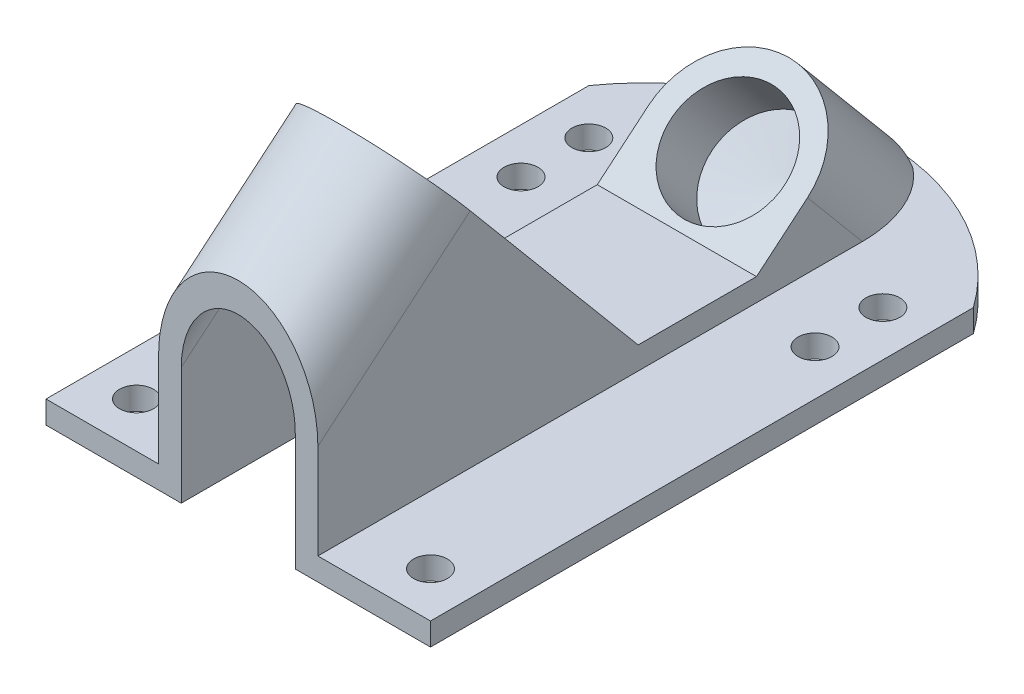
ISO-10303-21;
HEADER;
FILE_DESCRIPTION(('STEP AP214'),'2;1');
FILE_NAME('part.step','',(''),(''),'','','');
FILE_SCHEMA(('AUTOMOTIVE_DESIGN { 1 0 10303 214 1 1 1 1 }'));
ENDSEC;
DATA;
#1=APPLICATION_CONTEXT('core data for automotive mechanical design processes');
#2=APPLICATION_PROTOCOL_DEFINITION('international standard','automotive_design',2000,#1);
#3=PRODUCT_CONTEXT('',#1,'mechanical');
#4=PRODUCT('Part','Part','',(#3));
#5=PRODUCT_RELATED_PRODUCT_CATEGORY('part','',(#4));
#6=PRODUCT_DEFINITION_FORMATION('','',#4);
#7=PRODUCT_DEFINITION_CONTEXT('part definition',#1,'design');
#8=PRODUCT_DEFINITION('design','',#6,#7);
#9=PRODUCT_DEFINITION_SHAPE('','',#8);
#10=(LENGTH_UNIT() NAMED_UNIT(*) SI_UNIT(.MILLI.,.METRE.));
#11=(NAMED_UNIT(*) PLANE_ANGLE_UNIT() SI_UNIT($,.RADIAN.));
#12=(NAMED_UNIT(*) SI_UNIT($,.STERADIAN.) SOLID_ANGLE_UNIT());
#13=UNCERTAINTY_MEASURE_WITH_UNIT(LENGTH_MEASURE(1.E-05),#10,'distance_accuracy_value','');
#14=(GEOMETRIC_REPRESENTATION_CONTEXT(3) GLOBAL_UNCERTAINTY_ASSIGNED_CONTEXT((#13)) GLOBAL_UNIT_ASSIGNED_CONTEXT((#10,
#11,#12)) REPRESENTATION_CONTEXT('',''));
#15=CARTESIAN_POINT('',(0.,0.,0.));
#16=DIRECTION('',(0.,0.,1.));
#17=DIRECTION('',(1.,0.,0.));
#18=AXIS2_PLACEMENT_3D('',#15,#16,#17);
#19=CARTESIAN_POINT('',(0.,-25.0141169265101,-20.98933628726));
#20=DIRECTION('',(0.,0.766044443118977,0.64278760968654));
#21=DIRECTION('',(0.,-0.64278760968654,0.766044443118977));
#22=AXIS2_PLACEMENT_3D('',#19,#20,#21);
#23=PLANE('',#22);
#24=CARTESIAN_POINT('',(5.80920370903883,0.,-50.8));
#25=CARTESIAN_POINT('',(5.5597374760247,0.0975508140923163,-50.916256533155));
#26=CARTESIAN_POINT('',(5.30385348653295,0.188074625236957,-51.024138610302));
#27=CARTESIAN_POINT('',(4.7813617057208,0.355032638458759,-51.2231114223714));
#28=CARTESIAN_POINT('',(4.51476013955797,0.431474879596498,-51.3142117378733));
#29=CARTESIAN_POINT('',(3.70217235590198,0.639635215240299,-51.5622875657124));
#30=CARTESIAN_POINT('',(3.14287011696679,0.750391983854874,-51.694282342613));
#31=CARTESIAN_POINT('',(2.00519009620841,0.915859507768061,-51.8914788586942));
#32=CARTESIAN_POINT('',(1.42681744004951,0.970585198136284,-51.9566983967977));
#33=CARTESIAN_POINT('',(0.263865864662572,1.02440360541682,-52.020836677022));
#34=CARTESIAN_POINT('',(-0.320712427646291,1.02350188955882,-52.0197620539087));
#35=CARTESIAN_POINT('',(-1.48323459483363,0.966066932130411,-51.9513137370529));
#36=CARTESIAN_POINT('',(-2.0611781130222,0.909530713649846,-51.8839364955669));
#37=CARTESIAN_POINT('',(-3.18145877559244,0.742835579797626,-51.6852769709305));
#38=CARTESIAN_POINT('',(-3.72433952345924,0.634217809380674,-51.5558313528166));
#39=CARTESIAN_POINT('',(-4.52028655505767,0.429922538140716,-51.3123617293664));
#40=CARTESIAN_POINT('',(-4.78571929574432,0.353711161131642,-51.2215365470193));
#41=CARTESIAN_POINT('',(-5.30596477437662,0.187328202434981,-51.0232490582461));
#42=CARTESIAN_POINT('',(-5.56077088309034,0.097148067166662,-50.9157765580594));
#43=CARTESIAN_POINT('',(-5.80920370903882,0.,-50.8));
#44=B_SPLINE_CURVE_WITH_KNOTS('',3,(#24,#25,#26,#27,#28,#29,#30,#31,#32,#33,#34,#35,#36,#37,#38,
#39,#40,#41,#42,#43),.UNSPECIFIED.,.F.,.F.,(4,2,2,2,2,2,2,2,2,4),(0.,0.875380080114651,
1.75025885309408,3.49817536887797,5.24562585657085,6.9929014584814,8.74027055930166,
10.4388553372866,11.3100964019254,12.1818730837809),.UNSPECIFIED.);
#45=CARTESIAN_POINT('',(5.80920370903883,0.,-50.8));
#46=VERTEX_POINT('',#45);
#47=CARTESIAN_POINT('',(-5.80920370903881,0.,-50.8));
#48=VERTEX_POINT('',#47);
#49=EDGE_CURVE('E179',#46,#48,#44,.T.);
#50=ORIENTED_EDGE('',*,*,#49,.T.);
#51=CARTESIAN_POINT('',(0.,-6.13706088898307,-43.486135637585));
#52=DIRECTION('',(0.,0.766044443118977,0.64278760968654));
#53=DIRECTION('',(0.,-0.64278760968654,0.766044443118977));
#54=AXIS2_PLACEMENT_3D('',#51,#52,#53);
#55=CIRCLE('',#54,11.176);
#56=EDGE_CURVE('E176',#46,#48,#55,.T.);
#57=ORIENTED_EDGE('',*,*,#56,.F.);
#58=EDGE_LOOP('',(#50,#57));
#59=FACE_BOUND('',#58,.T.);
#60=ADVANCED_FACE('F52',(#59),#23,.F.);
#61=CARTESIAN_POINT('',(0.,2.3932711414289,-36.3283371770466));
#62=DIRECTION('',(0.,0.766044443118978,0.64278760968654));
#63=DIRECTION('',(0.,-0.64278760968654,0.766044443118978));
#64=AXIS2_PLACEMENT_3D('',#61,#62,#63);
#65=CONICAL_SURFACE('',#64,8.00100000000001,1.19729586686811);
#66=CARTESIAN_POINT('',(0.,-0.00870534403125435,-38.3438347600927));
#67=VERTEX_POINT('',#66);
#68=VERTEX_LOOP('',#67);
#69=FACE_BOUND('',#68,.T.);
#70=CARTESIAN_POINT('',(0.,2.39327114142889,-36.3283371770466));
#71=DIRECTION('',(0.,0.766044443118978,0.64278760968654));
#72=DIRECTION('',(0.,-0.64278760968654,0.766044443118978));
#73=AXIS2_PLACEMENT_3D('',#70,#71,#72);
#74=CIRCLE('',#73,8.001);
#75=CARTESIAN_POINT('',(0.,-2.74967252367311,-30.1992155876517));
#76=VERTEX_POINT('',#75);
#77=EDGE_CURVE('E456',#76,#76,#74,.F.);
#78=ORIENTED_EDGE('',*,*,#77,.F.);
#79=EDGE_LOOP('',(#78));
#80=FACE_BOUND('',#79,.T.);
#81=ADVANCED_FACE('F222',(#69,#80),#65,.F.);
#82=CARTESIAN_POINT('',(0.,-10.7308344214764,-47.3407693144122));
#83=DIRECTION('',(0.,0.766044443118977,0.64278760968654));
#84=DIRECTION('',(0.,-0.64278760968654,0.766044443118977));
#85=AXIS2_PLACEMENT_3D('',#82,#83,#84);
#86=CYLINDRICAL_SURFACE('',#85,8.001);
#87=CARTESIAN_POINT('',(0.,9.18382797339647,-30.6303834438542));
#88=DIRECTION('',(0.,0.766044443118977,0.64278760968654));
#89=DIRECTION('',(0.,-0.64278760968654,0.766044443118977));
#90=AXIS2_PLACEMENT_3D('',#87,#88,#89);
#91=CIRCLE('',#90,8.001);
#92=CARTESIAN_POINT('',(0.,4.04088430829446,-24.5012618544593));
#93=VERTEX_POINT('',#92);
#94=EDGE_CURVE('E202',#93,#93,#91,.T.);
#95=ORIENTED_EDGE('',*,*,#94,.T.);
#96=EDGE_LOOP('',(#95));
#97=FACE_BOUND('',#96,.T.);
#98=ORIENTED_EDGE('',*,*,#77,.T.);
#99=EDGE_LOOP('',(#98));
#100=FACE_BOUND('',#99,.T.);
#101=ADVANCED_FACE('F218',(#97,#100),#86,.F.);
#102=CARTESIAN_POINT('',(0.,-3.175,0.));
#103=DIRECTION('',(0.,1.,0.));
#104=DIRECTION('',(0.,0.,1.));
#105=AXIS2_PLACEMENT_3D('',#102,#103,#104);
#106=PLANE('',#105);
#107=CARTESIAN_POINT('',(0.,-3.175,-18.96410401224));
#108=DIRECTION('',(0.,1.,0.));
#109=DIRECTION('',(0.,0.,1.));
#110=AXIS2_PLACEMENT_3D('',#107,#108,#109);
#111=CIRCLE('',#110,33.0833443216427);
#112=CARTESIAN_POINT('',(-26.9875,-3.175,-38.1));
#113=VERTEX_POINT('',#112);
#114=CARTESIAN_POINT('',(26.9875,-3.175,-38.1));
#115=VERTEX_POINT('',#114);
#116=EDGE_CURVE('E404',#113,#115,#111,.F.);
#117=ORIENTED_EDGE('',*,*,#116,.T.);
#118=DIRECTION('',(0.,0.,-1.));
#119=VECTOR('',#118,1.);
#120=CARTESIAN_POINT('',(26.9875,-3.175,0.));
#121=LINE('',#120,#119);
#122=CARTESIAN_POINT('',(26.9875,-3.175,38.1));
#123=VERTEX_POINT('',#122);
#124=EDGE_CURVE('E370',#123,#115,#121,.T.);
#125=ORIENTED_EDGE('',*,*,#124,.F.);
#126=DIRECTION('',(-1.,0.,0.));
#127=VECTOR('',#126,1.);
#128=CARTESIAN_POINT('',(0.,-3.175,38.1));
#129=LINE('',#128,#127);
#130=CARTESIAN_POINT('',(8.00100000000003,-3.175,38.1));
#131=VERTEX_POINT('',#130);
#132=EDGE_CURVE('E368',#123,#131,#129,.T.);
#133=ORIENTED_EDGE('',*,*,#132,.T.);
#134=DIRECTION('',(0.,0.,1.));
#135=VECTOR('',#134,1.);
#136=CARTESIAN_POINT('',(8.00100000000002,-3.175,0.));
#137=LINE('',#136,#135);
#138=CARTESIAN_POINT('',(8.00100000000002,-3.175,-3.68585867101214));
#139=VERTEX_POINT('',#138);
#140=EDGE_CURVE('E329',#139,#131,#137,.T.);
#141=ORIENTED_EDGE('',*,*,#140,.F.);
#142=DIRECTION('',(1.,0.,0.));
#143=VECTOR('',#142,1.);
#144=CARTESIAN_POINT('',(0.,-3.175,-3.68585867101214));
#145=LINE('',#144,#143);
#146=CARTESIAN_POINT('',(-8.00099999999999,-3.175,-3.68585867101214));
#147=VERTEX_POINT('',#146);
#148=EDGE_CURVE('E328',#147,#139,#145,.T.);
#149=ORIENTED_EDGE('',*,*,#148,.F.);
#150=DIRECTION('',(0.,0.,1.));
#151=VECTOR('',#150,1.);
#152=CARTESIAN_POINT('',(-8.00099999999999,-3.175,0.));
#153=LINE('',#152,#151);
#154=CARTESIAN_POINT('',(-8.00099999999998,-3.175,38.1));
#155=VERTEX_POINT('',#154);
#156=EDGE_CURVE('E333',#147,#155,#153,.T.);
#157=ORIENTED_EDGE('',*,*,#156,.T.);
#158=CARTESIAN_POINT('',(-26.9875,-3.175,38.1));
#159=VERTEX_POINT('',#158);
#160=EDGE_CURVE('E366',#155,#159,#129,.T.);
#161=ORIENTED_EDGE('',*,*,#160,.T.);
#162=DIRECTION('',(0.,0.,-1.));
#163=VECTOR('',#162,1.);
#164=CARTESIAN_POINT('',(-26.9875,-3.175,0.));
#165=LINE('',#164,#163);
#166=EDGE_CURVE('E364',#159,#113,#165,.T.);
#167=ORIENTED_EDGE('',*,*,#166,.T.);
#168=EDGE_LOOP('',(#117,#125,#133,#141,#149,#157,#161,#167));
#169=FACE_BOUND('',#168,.T.);
#170=CARTESIAN_POINT('',(-20.6375,-3.175,31.75));
#171=DIRECTION('',(0.,1.,0.));
#172=DIRECTION('',(0.,0.,1.));
#173=AXIS2_PLACEMENT_3D('',#170,#171,#172);
#174=CIRCLE('',#173,2.38125);
#175=CARTESIAN_POINT('',(-20.6375,-3.175,34.13125));
#176=VERTEX_POINT('',#175);
#177=EDGE_CURVE('E374',#176,#176,#174,.T.);
#178=ORIENTED_EDGE('',*,*,#177,.T.);
#179=EDGE_LOOP('',(#178));
#180=FACE_BOUND('',#179,.T.);
#181=CARTESIAN_POINT('',(20.6375,-3.175,31.75));
#182=DIRECTION('',(0.,1.,0.));
#183=DIRECTION('',(0.,0.,1.));
#184=AXIS2_PLACEMENT_3D('',#181,#182,#183);
#185=CIRCLE('',#184,2.38125);
#186=CARTESIAN_POINT('',(20.6375,-3.175,34.13125));
#187=VERTEX_POINT('',#186);
#188=EDGE_CURVE('E371',#187,#187,#185,.F.);
#189=ORIENTED_EDGE('',*,*,#188,.F.);
#190=EDGE_LOOP('',(#189));
#191=FACE_BOUND('',#190,.T.);
#192=CARTESIAN_POINT('',(20.6375,-3.175,-22.225));
#193=DIRECTION('',(0.,1.,0.));
#194=DIRECTION('',(0.,0.,1.));
#195=AXIS2_PLACEMENT_3D('',#192,#193,#194);
#196=CIRCLE('',#195,2.38125);
#197=CARTESIAN_POINT('',(20.6375,-3.175,-19.84375));
#198=VERTEX_POINT('',#197);
#199=EDGE_CURVE('E422',#198,#198,#196,.F.);
#200=ORIENTED_EDGE('',*,*,#199,.F.);
#201=EDGE_LOOP('',(#200));
#202=FACE_BOUND('',#201,.T.);
#203=CARTESIAN_POINT('',(20.6375,-3.175,-31.75));
#204=DIRECTION('',(0.,1.,0.));
#205=DIRECTION('',(0.,0.,1.));
#206=AXIS2_PLACEMENT_3D('',#203,#204,#205);
#207=CIRCLE('',#206,2.38125);
#208=CARTESIAN_POINT('',(20.6375,-3.175,-29.36875));
#209=VERTEX_POINT('',#208);
#210=EDGE_CURVE('E436',#209,#209,#207,.F.);
#211=ORIENTED_EDGE('',*,*,#210,.F.);
#212=EDGE_LOOP('',(#211));
#213=FACE_BOUND('',#212,.T.);
#214=CARTESIAN_POINT('',(-20.6375,-3.175,-22.225));
#215=DIRECTION('',(0.,1.,0.));
#216=DIRECTION('',(0.,0.,1.));
#217=AXIS2_PLACEMENT_3D('',#214,#215,#216);
#218=CIRCLE('',#217,2.38125);
#219=CARTESIAN_POINT('',(-20.6375,-3.175,-19.84375));
#220=VERTEX_POINT('',#219);
#221=EDGE_CURVE('E433',#220,#220,#218,.T.);
#222=ORIENTED_EDGE('',*,*,#221,.T.);
#223=EDGE_LOOP('',(#222));
#224=FACE_BOUND('',#223,.T.);
#225=CARTESIAN_POINT('',(-20.6375,-3.175,-31.75));
#226=DIRECTION('',(0.,1.,0.));
#227=DIRECTION('',(0.,0.,1.));
#228=AXIS2_PLACEMENT_3D('',#225,#226,#227);
#229=CIRCLE('',#228,2.38125);
#230=CARTESIAN_POINT('',(-20.6375,-3.175,-29.36875));
#231=VERTEX_POINT('',#230);
#232=EDGE_CURVE('E410',#231,#231,#229,.T.);
#233=ORIENTED_EDGE('',*,*,#232,.T.);
#234=EDGE_LOOP('',(#233));
#235=FACE_BOUND('',#234,.T.);
#236=ADVANCED_FACE('F221',(#169,#180,#191,#202,#213,#224,#235),#106,.F.);
#237=CARTESIAN_POINT('',(0.,9.1287450574881,43.0957852818618));
#238=DIRECTION('',(0.,0.64278760968654,-0.766044443118977));
#239=DIRECTION('',(0.,0.766044443118977,0.64278760968654));
#240=AXIS2_PLACEMENT_3D('',#237,#238,#239);
#241=CYLINDRICAL_SURFACE('',#240,4.76250000000001);
#242=CARTESIAN_POINT('',(0.,31.2676461581376,16.711670359075));
#243=DIRECTION('',(0.,-0.64278760968654,0.766044443118977));
#244=DIRECTION('',(0.,-0.766044443118977,-0.64278760968654));
#245=AXIS2_PLACEMENT_3D('',#242,#243,#244);
#246=CIRCLE('',#245,4.76250000000001);
#247=CARTESIAN_POINT('',(0.,27.6193594977834,13.6503943679428));
#248=VERTEX_POINT('',#247);
#249=EDGE_CURVE('E352',#248,#248,#246,.T.);
#250=ORIENTED_EDGE('',*,*,#249,.F.);
#251=EDGE_LOOP('',(#250));
#252=FACE_BOUND('',#251,.T.);
#253=CARTESIAN_POINT('',(0.,29.2267954973828,19.1438614659777));
#254=DIRECTION('',(0.,-0.64278760968654,0.766044443118977));
#255=DIRECTION('',(0.,-0.766044443118977,-0.64278760968654));
#256=AXIS2_PLACEMENT_3D('',#253,#254,#255);
#257=CIRCLE('',#256,4.76250000000001);
#258=CARTESIAN_POINT('',(0.,25.5785088370287,16.0825854748456));
#259=VERTEX_POINT('',#258);
#260=EDGE_CURVE('E338',#259,#259,#257,.T.);
#261=ORIENTED_EDGE('',*,*,#260,.T.);
#262=EDGE_LOOP('',(#261));
#263=FACE_BOUND('',#262,.T.);
#264=ADVANCED_FACE('F284',(#252,#263),#241,.F.);
#265=CARTESIAN_POINT('',(11.176,-25.0141169265101,-20.98933628726));
#266=DIRECTION('',(-1.,0.,0.));
#267=DIRECTION('',(0.,0.,1.));
#268=AXIS2_PLACEMENT_3D('',#265,#266,#267);
#269=PLANE('',#268);
#270=DIRECTION('',(0.,0.,1.));
#271=VECTOR('',#270,1.);
#272=CARTESIAN_POINT('',(11.176,0.,0.));
#273=LINE('',#272,#271);
#274=CARTESIAN_POINT('',(11.176,0.,-38.3365301091268));
#275=VERTEX_POINT('',#274);
#276=CARTESIAN_POINT('',(11.176,0.,38.1));
#277=VERTEX_POINT('',#276);
#278=EDGE_CURVE('E61',#275,#277,#273,.T.);
#279=ORIENTED_EDGE('',*,*,#278,.F.);
#280=DIRECTION('',(0.,0.766044443118977,0.64278760968654));
#281=VECTOR('',#280,1.);
#282=CARTESIAN_POINT('',(11.176,-6.13706088898307,-43.486135637585));
#283=LINE('',#282,#281);
#284=CARTESIAN_POINT('',(11.176,9.18382797339647,-30.6303834438542));
#285=VERTEX_POINT('',#284);
#286=EDGE_CURVE('E192',#275,#285,#283,.T.);
#287=ORIENTED_EDGE('',*,*,#286,.T.);
#288=DIRECTION('',(0.,-0.64278760968654,0.766044443118977));
#289=VECTOR('',#288,1.);
#290=CARTESIAN_POINT('',(11.176,-9.69322806413055,-8.13358409352923));
#291=LINE('',#290,#289);
#292=CARTESIAN_POINT('',(11.176,3.175,-23.4693411192784));
#293=VERTEX_POINT('',#292);
#294=EDGE_CURVE('E183',#285,#293,#291,.T.);
#295=ORIENTED_EDGE('',*,*,#294,.T.);
#296=DIRECTION('',(0.,0.,1.));
#297=VECTOR('',#296,1.);
#298=CARTESIAN_POINT('',(11.176,3.175,0.));
#299=LINE('',#298,#297);
#300=CARTESIAN_POINT('',(11.176,3.175,-6.86085867101214));
#301=VERTEX_POINT('',#300);
#302=EDGE_CURVE('E469',#293,#301,#299,.T.);
#303=ORIENTED_EDGE('',*,*,#302,.T.);
#304=DIRECTION('',(0.,0.766044443118977,0.64278760968654));
#305=VECTOR('',#304,1.);
#306=CARTESIAN_POINT('',(11.176,4.69014692372065,-5.58949944613875));
#307=LINE('',#306,#305);
#308=CARTESIAN_POINT('',(11.176,31.2676461581376,16.711670359075));
#309=VERTEX_POINT('',#308);
#310=EDGE_CURVE('E342',#301,#309,#307,.T.);
#311=ORIENTED_EDGE('',*,*,#310,.T.);
#312=DIRECTION('',(0.,0.64278760968654,-0.766044443118977));
#313=VECTOR('',#312,1.);
#314=CARTESIAN_POINT('',(11.176,9.12874505748812,43.0957852818619));
#315=LINE('',#314,#313);
#316=CARTESIAN_POINT('',(11.176,13.3207066449393,38.1));
#317=VERTEX_POINT('',#316);
#318=EDGE_CURVE('E357',#317,#309,#315,.T.);
#319=ORIENTED_EDGE('',*,*,#318,.F.);
#320=DIRECTION('',(0.,-1.,0.));
#321=VECTOR('',#320,1.);
#322=CARTESIAN_POINT('',(11.176,3.175,38.1));
#323=LINE('',#322,#321);
#324=EDGE_CURVE('E76',#317,#277,#323,.T.);
#325=ORIENTED_EDGE('',*,*,#324,.T.);
#326=EDGE_LOOP('',(#279,#287,#295,#303,#311,#319,#325));
#327=FACE_BOUND('',#326,.T.);
#328=ADVANCED_FACE('F266',(#327),#269,.F.);
#329=CARTESIAN_POINT('',(-11.176,-25.0141169265101,-20.98933628726));
#330=DIRECTION('',(-1.,0.,0.));
#331=DIRECTION('',(0.,0.,1.));
#332=AXIS2_PLACEMENT_3D('',#329,#330,#331);
#333=PLANE('',#332);
#334=DIRECTION('',(0.,-0.766044443118977,-0.64278760968654));
#335=VECTOR('',#334,1.);
#336=CARTESIAN_POINT('',(-11.176,4.69014692372065,-5.58949944613875));
#337=LINE('',#336,#335);
#338=CARTESIAN_POINT('',(-11.176,31.2676461581376,16.711670359075));
#339=VERTEX_POINT('',#338);
#340=CARTESIAN_POINT('',(-11.176,3.175,-6.86085867101214));
#341=VERTEX_POINT('',#340);
#342=EDGE_CURVE('E349',#339,#341,#337,.T.);
#343=ORIENTED_EDGE('',*,*,#342,.T.);
#344=DIRECTION('',(0.,0.,1.));
#345=VECTOR('',#344,1.);
#346=CARTESIAN_POINT('',(-11.176,3.175,0.));
#347=LINE('',#346,#345);
#348=CARTESIAN_POINT('',(-11.176,3.175,-23.4693411192784));
#349=VERTEX_POINT('',#348);
#350=EDGE_CURVE('E451',#349,#341,#347,.T.);
#351=ORIENTED_EDGE('',*,*,#350,.F.);
#352=DIRECTION('',(0.,-0.64278760968654,0.766044443118977));
#353=VECTOR('',#352,1.);
#354=CARTESIAN_POINT('',(-11.176,-9.69322806413056,-8.13358409352923));
#355=LINE('',#354,#353);
#356=CARTESIAN_POINT('',(-11.176,9.18382797339647,-30.6303834438542));
#357=VERTEX_POINT('',#356);
#358=EDGE_CURVE('E445',#357,#349,#355,.T.);
#359=ORIENTED_EDGE('',*,*,#358,.F.);
#360=DIRECTION('',(0.,0.766044443118977,0.64278760968654));
#361=VECTOR('',#360,1.);
#362=CARTESIAN_POINT('',(-11.176,-6.13706088898308,-43.486135637585));
#363=LINE('',#362,#361);
#364=CARTESIAN_POINT('',(-11.176,0.,-38.3365301091268));
#365=VERTEX_POINT('',#364);
#366=EDGE_CURVE('E184',#365,#357,#363,.T.);
#367=ORIENTED_EDGE('',*,*,#366,.F.);
#368=DIRECTION('',(0.,0.,1.));
#369=VECTOR('',#368,1.);
#370=CARTESIAN_POINT('',(-11.176,0.,0.));
#371=LINE('',#370,#369);
#372=CARTESIAN_POINT('',(-11.176,0.,38.1));
#373=VERTEX_POINT('',#372);
#374=EDGE_CURVE('E391',#365,#373,#371,.T.);
#375=ORIENTED_EDGE('',*,*,#374,.T.);
#376=DIRECTION('',(0.,-1.,0.));
#377=VECTOR('',#376,1.);
#378=CARTESIAN_POINT('',(-11.176,3.175,38.1));
#379=LINE('',#378,#377);
#380=CARTESIAN_POINT('',(-11.176,13.3207066449393,38.1));
#381=VERTEX_POINT('',#380);
#382=EDGE_CURVE('E360',#381,#373,#379,.T.);
#383=ORIENTED_EDGE('',*,*,#382,.F.);
#384=DIRECTION('',(0.,0.64278760968654,-0.766044443118977));
#385=VECTOR('',#384,1.);
#386=CARTESIAN_POINT('',(-11.176,9.1287450574881,43.0957852818618));
#387=LINE('',#386,#385);
#388=EDGE_CURVE('E355',#381,#339,#387,.T.);
#389=ORIENTED_EDGE('',*,*,#388,.T.);
#390=EDGE_LOOP('',(#343,#351,#359,#367,#375,#383,#389));
#391=FACE_BOUND('',#390,.T.);
#392=ADVANCED_FACE('F291',(#391),#333,.T.);
#393=CARTESIAN_POINT('',(0.,9.1287450574881,43.0957852818618));
#394=DIRECTION('',(0.,0.64278760968654,-0.766044443118977));
#395=DIRECTION('',(0.,0.766044443118977,0.64278760968654));
#396=AXIS2_PLACEMENT_3D('',#393,#394,#395);
#397=CYLINDRICAL_SURFACE('',#396,11.176);
#398=CARTESIAN_POINT('',(0.,13.3207066449393,38.1));
#399=DIRECTION('',(0.,0.,1.));
#400=DIRECTION('',(0.,1.,0.));
#401=AXIS2_PLACEMENT_3D('',#398,#399,#400);
#402=ELLIPSE('',#401,14.5892318655776,11.176);
#403=EDGE_CURVE('E12',#317,#381,#402,.T.);
#404=ORIENTED_EDGE('',*,*,#403,.F.);
#405=ORIENTED_EDGE('',*,*,#318,.T.);
#406=CARTESIAN_POINT('',(0.,31.2676461581376,16.711670359075));
#407=DIRECTION('',(0.,-0.64278760968654,0.766044443118977));
#408=DIRECTION('',(0.,-0.766044443118977,-0.64278760968654));
#409=AXIS2_PLACEMENT_3D('',#406,#407,#408);
#410=CIRCLE('',#409,11.176);
#411=EDGE_CURVE('E345',#309,#339,#410,.T.);
#412=ORIENTED_EDGE('',*,*,#411,.T.);
#413=ORIENTED_EDGE('',*,*,#388,.F.);
#414=EDGE_LOOP('',(#404,#405,#412,#413));
#415=FACE_BOUND('',#414,.T.);
#416=ADVANCED_FACE('F288',(#415),#397,.T.);
#417=CARTESIAN_POINT('',(0.,0.,0.));
#418=DIRECTION('',(0.,1.,0.));
#419=DIRECTION('',(0.,0.,1.));
#420=AXIS2_PLACEMENT_3D('',#417,#418,#419);
#421=PLANE('',#420);
#422=CARTESIAN_POINT('',(0.,0.,-38.3365301091268));
#423=DIRECTION('',(0.,-1.,0.));
#424=DIRECTION('',(0.,0.,1.));
#425=AXIS2_PLACEMENT_3D('',#422,#423,#424);
#426=ELLIPSE('',#425,14.5892318655776,11.176);
#427=EDGE_CURVE('E194',#48,#365,#426,.F.);
#428=ORIENTED_EDGE('',*,*,#427,.F.);
#429=CARTESIAN_POINT('',(0.,0.,-45.6195722370173));
#430=DIRECTION('',(0.,1.,0.));
#431=DIRECTION('',(1.,0.,0.));
#432=AXIS2_PLACEMENT_3D('',#429,#430,#431);
#433=ELLIPSE('',#432,9.91528886008315,6.39246998600875);
#434=EDGE_CURVE('E198',#46,#48,#433,.T.);
#435=ORIENTED_EDGE('',*,*,#434,.F.);
#436=EDGE_CURVE('E188',#275,#46,#426,.F.);
#437=ORIENTED_EDGE('',*,*,#436,.F.);
#438=ORIENTED_EDGE('',*,*,#278,.T.);
#439=DIRECTION('',(-1.,0.,0.));
#440=VECTOR('',#439,1.);
#441=CARTESIAN_POINT('',(0.,0.,38.1));
#442=LINE('',#441,#440);
#443=CARTESIAN_POINT('',(26.9875,0.,38.1));
#444=VERTEX_POINT('',#443);
#445=EDGE_CURVE('E380',#444,#277,#442,.T.);
#446=ORIENTED_EDGE('',*,*,#445,.F.);
#447=DIRECTION('',(0.,0.,-1.));
#448=VECTOR('',#447,1.);
#449=CARTESIAN_POINT('',(26.9875,0.,0.));
#450=LINE('',#449,#448);
#451=CARTESIAN_POINT('',(26.9875,0.,-38.1));
#452=VERTEX_POINT('',#451);
#453=EDGE_CURVE('E382',#444,#452,#450,.T.);
#454=ORIENTED_EDGE('',*,*,#453,.T.);
#455=CARTESIAN_POINT('',(0.,0.,-18.96410401224));
#456=DIRECTION('',(0.,1.,0.));
#457=DIRECTION('',(0.,0.,-1.));
#458=AXIS2_PLACEMENT_3D('',#455,#456,#457);
#459=CIRCLE('',#458,33.0833443216427);
#460=CARTESIAN_POINT('',(-26.9875,0.,-38.1));
#461=VERTEX_POINT('',#460);
#462=EDGE_CURVE('E406',#452,#461,#459,.T.);
#463=ORIENTED_EDGE('',*,*,#462,.T.);
#464=DIRECTION('',(0.,0.,-1.));
#465=VECTOR('',#464,1.);
#466=CARTESIAN_POINT('',(-26.9875,0.,0.));
#467=LINE('',#466,#465);
#468=CARTESIAN_POINT('',(-26.9875,0.,38.1));
#469=VERTEX_POINT('',#468);
#470=EDGE_CURVE('E363',#469,#461,#467,.T.);
#471=ORIENTED_EDGE('',*,*,#470,.F.);
#472=EDGE_CURVE('E379',#373,#469,#442,.T.);
#473=ORIENTED_EDGE('',*,*,#472,.F.);
#474=ORIENTED_EDGE('',*,*,#374,.F.);
#475=EDGE_LOOP('',(#428,#435,#437,#438,#446,#454,#463,#471,#473,#474));
#476=FACE_BOUND('',#475,.T.);
#477=CARTESIAN_POINT('',(20.6375,0.,31.75));
#478=DIRECTION('',(0.,1.,0.));
#479=DIRECTION('',(0.,0.,1.));
#480=AXIS2_PLACEMENT_3D('',#477,#478,#479);
#481=CIRCLE('',#480,2.38125);
#482=CARTESIAN_POINT('',(20.6375,0.,34.13125));
#483=VERTEX_POINT('',#482);
#484=EDGE_CURVE('E384',#483,#483,#481,.F.);
#485=ORIENTED_EDGE('',*,*,#484,.T.);
#486=EDGE_LOOP('',(#485));
#487=FACE_BOUND('',#486,.T.);
#488=CARTESIAN_POINT('',(20.6375,0.,-22.225));
#489=DIRECTION('',(0.,1.,0.));
#490=DIRECTION('',(0.,0.,1.));
#491=AXIS2_PLACEMENT_3D('',#488,#489,#490);
#492=CIRCLE('',#491,2.38125);
#493=CARTESIAN_POINT('',(20.6375,0.,-19.84375));
#494=VERTEX_POINT('',#493);
#495=EDGE_CURVE('E428',#494,#494,#492,.F.);
#496=ORIENTED_EDGE('',*,*,#495,.T.);
#497=EDGE_LOOP('',(#496));
#498=FACE_BOUND('',#497,.T.);
#499=CARTESIAN_POINT('',(20.6375,0.,-31.75));
#500=DIRECTION('',(0.,1.,0.));
#501=DIRECTION('',(0.,0.,1.));
#502=AXIS2_PLACEMENT_3D('',#499,#500,#501);
#503=CIRCLE('',#502,2.38125);
#504=CARTESIAN_POINT('',(20.6375,0.,-29.36875));
#505=VERTEX_POINT('',#504);
#506=EDGE_CURVE('E425',#505,#505,#503,.F.);
#507=ORIENTED_EDGE('',*,*,#506,.T.);
#508=EDGE_LOOP('',(#507));
#509=FACE_BOUND('',#508,.T.);
#510=CARTESIAN_POINT('',(-20.6375,0.,-22.225));
#511=DIRECTION('',(0.,1.,0.));
#512=DIRECTION('',(0.,0.,1.));
#513=AXIS2_PLACEMENT_3D('',#510,#511,#512);
#514=CIRCLE('',#513,2.38125);
#515=CARTESIAN_POINT('',(-20.6375,0.,-19.84375));
#516=VERTEX_POINT('',#515);
#517=EDGE_CURVE('E421',#516,#516,#514,.T.);
#518=ORIENTED_EDGE('',*,*,#517,.F.);
#519=EDGE_LOOP('',(#518));
#520=FACE_BOUND('',#519,.T.);
#521=CARTESIAN_POINT('',(-20.6375,0.,-31.75));
#522=DIRECTION('',(0.,1.,0.));
#523=DIRECTION('',(0.,0.,1.));
#524=AXIS2_PLACEMENT_3D('',#521,#522,#523);
#525=CIRCLE('',#524,2.38125);
#526=CARTESIAN_POINT('',(-20.6375,0.,-29.36875));
#527=VERTEX_POINT('',#526);
#528=EDGE_CURVE('E418',#527,#527,#525,.T.);
#529=ORIENTED_EDGE('',*,*,#528,.F.);
#530=EDGE_LOOP('',(#529));
#531=FACE_BOUND('',#530,.T.);
#532=CARTESIAN_POINT('',(-20.6375,0.,31.75));
#533=DIRECTION('',(0.,1.,0.));
#534=DIRECTION('',(0.,0.,1.));
#535=AXIS2_PLACEMENT_3D('',#532,#533,#534);
#536=CIRCLE('',#535,2.38125);
#537=CARTESIAN_POINT('',(-20.6375,0.,34.13125));
#538=VERTEX_POINT('',#537);
#539=EDGE_CURVE('E367',#538,#538,#536,.T.);
#540=ORIENTED_EDGE('',*,*,#539,.F.);
#541=EDGE_LOOP('',(#540));
#542=FACE_BOUND('',#541,.T.);
#543=ADVANCED_FACE('F199',(#476,#487,#498,#509,#520,#531,#542),#421,.T.);
#544=CARTESIAN_POINT('',(26.9875,-3.175,0.));
#545=DIRECTION('',(1.,0.,0.));
#546=DIRECTION('',(0.,0.,-1.));
#547=AXIS2_PLACEMENT_3D('',#544,#545,#546);
#548=PLANE('',#547);
#549=ORIENTED_EDGE('',*,*,#124,.T.);
#550=DIRECTION('',(0.,1.,0.));
#551=VECTOR('',#550,1.);
#552=CARTESIAN_POINT('',(26.9875,-3.175,-38.1));
#553=LINE('',#552,#551);
#554=EDGE_CURVE('E400',#115,#452,#553,.T.);
#555=ORIENTED_EDGE('',*,*,#554,.T.);
#556=ORIENTED_EDGE('',*,*,#453,.F.);
#557=DIRECTION('',(0.,1.,0.));
#558=VECTOR('',#557,1.);
#559=CARTESIAN_POINT('',(26.9875,-3.175,38.1));
#560=LINE('',#559,#558);
#561=EDGE_CURVE('E389',#123,#444,#560,.T.);
#562=ORIENTED_EDGE('',*,*,#561,.F.);
#563=EDGE_LOOP('',(#549,#555,#556,#562));
#564=FACE_BOUND('',#563,.T.);
#565=ADVANCED_FACE('F304',(#564),#548,.T.);
#566=CARTESIAN_POINT('',(0.,-3.175,38.1));
#567=DIRECTION('',(0.,0.,-1.));
#568=DIRECTION('',(-1.,0.,0.));
#569=AXIS2_PLACEMENT_3D('',#566,#567,#568);
#570=PLANE('',#569);
#571=CARTESIAN_POINT('',(0.,13.3207066449393,38.1));
#572=DIRECTION('',(0.,0.,-1.));
#573=DIRECTION('',(0.,1.,0.));
#574=AXIS2_PLACEMENT_3D('',#571,#572,#573);
#575=ELLIPSE('',#574,10.4445637219476,8.00099999999999);
#576=CARTESIAN_POINT('',(8.001,13.3207066449393,38.1));
#577=VERTEX_POINT('',#576);
#578=CARTESIAN_POINT('',(-8.00099999999999,13.3207066449393,38.1));
#579=VERTEX_POINT('',#578);
#580=EDGE_CURVE('E321',#577,#579,#575,.F.);
#581=ORIENTED_EDGE('',*,*,#580,.F.);
#582=DIRECTION('',(0.,-1.,0.));
#583=VECTOR('',#582,1.);
#584=CARTESIAN_POINT('',(8.00100000000004,-25.0141169265101,38.1));
#585=LINE('',#584,#583);
#586=EDGE_CURVE('E323',#577,#131,#585,.T.);
#587=ORIENTED_EDGE('',*,*,#586,.T.);
#588=ORIENTED_EDGE('',*,*,#132,.F.);
#589=ORIENTED_EDGE('',*,*,#561,.T.);
#590=ORIENTED_EDGE('',*,*,#445,.T.);
#591=ORIENTED_EDGE('',*,*,#324,.F.);
#592=ORIENTED_EDGE('',*,*,#403,.T.);
#593=ORIENTED_EDGE('',*,*,#382,.T.);
#594=ORIENTED_EDGE('',*,*,#472,.T.);
#595=DIRECTION('',(0.,1.,0.));
#596=VECTOR('',#595,1.);
#597=CARTESIAN_POINT('',(-26.9875,-3.175,38.1));
#598=LINE('',#597,#596);
#599=EDGE_CURVE('E377',#159,#469,#598,.T.);
#600=ORIENTED_EDGE('',*,*,#599,.F.);
#601=ORIENTED_EDGE('',*,*,#160,.F.);
#602=DIRECTION('',(0.,-1.,0.));
#603=VECTOR('',#602,1.);
#604=CARTESIAN_POINT('',(-8.00099999999998,-25.0141169265101,38.1));
#605=LINE('',#604,#603);
#606=EDGE_CURVE('E326',#579,#155,#605,.T.);
#607=ORIENTED_EDGE('',*,*,#606,.F.);
#608=EDGE_LOOP('',(#581,#587,#588,#589,#590,#591,#592,#593,#594,#600,#601,#607));
#609=FACE_BOUND('',#608,.T.);
#610=ADVANCED_FACE('F311',(#609),#570,.F.);
#611=CARTESIAN_POINT('',(20.6375,-3.175,31.75));
#612=DIRECTION('',(0.,1.,0.));
#613=DIRECTION('',(0.,0.,1.));
#614=AXIS2_PLACEMENT_3D('',#611,#612,#613);
#615=CYLINDRICAL_SURFACE('',#614,2.38125);
#616=ORIENTED_EDGE('',*,*,#188,.T.);
#617=EDGE_LOOP('',(#616));
#618=FACE_BOUND('',#617,.T.);
#619=ORIENTED_EDGE('',*,*,#484,.F.);
#620=EDGE_LOOP('',(#619));
#621=FACE_BOUND('',#620,.T.);
#622=ADVANCED_FACE('F308',(#618,#621),#615,.F.);
#623=CARTESIAN_POINT('',(-26.9875,-3.175,0.));
#624=DIRECTION('',(1.,0.,0.));
#625=DIRECTION('',(0.,0.,-1.));
#626=AXIS2_PLACEMENT_3D('',#623,#624,#625);
#627=PLANE('',#626);
#628=ORIENTED_EDGE('',*,*,#470,.T.);
#629=DIRECTION('',(0.,1.,0.));
#630=VECTOR('',#629,1.);
#631=CARTESIAN_POINT('',(-26.9875,-3.175,-38.1));
#632=LINE('',#631,#630);
#633=EDGE_CURVE('E407',#113,#461,#632,.T.);
#634=ORIENTED_EDGE('',*,*,#633,.F.);
#635=ORIENTED_EDGE('',*,*,#166,.F.);
#636=ORIENTED_EDGE('',*,*,#599,.T.);
#637=EDGE_LOOP('',(#628,#634,#635,#636));
#638=FACE_BOUND('',#637,.T.);
#639=ADVANCED_FACE('F54',(#638),#627,.F.);
#640=CARTESIAN_POINT('',(-20.6375,-3.175,31.75));
#641=DIRECTION('',(0.,1.,0.));
#642=DIRECTION('',(0.,0.,1.));
#643=AXIS2_PLACEMENT_3D('',#640,#641,#642);
#644=CYLINDRICAL_SURFACE('',#643,2.38125);
#645=ORIENTED_EDGE('',*,*,#177,.F.);
#646=EDGE_LOOP('',(#645));
#647=FACE_BOUND('',#646,.T.);
#648=ORIENTED_EDGE('',*,*,#539,.T.);
#649=EDGE_LOOP('',(#648));
#650=FACE_BOUND('',#649,.T.);
#651=ADVANCED_FACE('F282',(#647,#650),#644,.F.);
#652=CARTESIAN_POINT('',(0.,4.69014692372065,-5.58949944613875));
#653=DIRECTION('',(0.,-0.64278760968654,0.766044443118977));
#654=DIRECTION('',(0.,-0.766044443118977,-0.64278760968654));
#655=AXIS2_PLACEMENT_3D('',#652,#653,#654);
#656=PLANE('',#655);
#657=DIRECTION('',(1.,0.,0.));
#658=VECTOR('',#657,1.);
#659=CARTESIAN_POINT('',(0.,3.175,-6.86085867101214));
#660=LINE('',#659,#658);
#661=EDGE_CURVE('E412',#341,#301,#660,.T.);
#662=ORIENTED_EDGE('',*,*,#661,.F.);
#663=ORIENTED_EDGE('',*,*,#342,.F.);
#664=ORIENTED_EDGE('',*,*,#411,.F.);
#665=ORIENTED_EDGE('',*,*,#310,.F.);
#666=EDGE_LOOP('',(#662,#663,#664,#665));
#667=FACE_BOUND('',#666,.T.);
#668=ORIENTED_EDGE('',*,*,#249,.T.);
#669=EDGE_LOOP('',(#668));
#670=FACE_BOUND('',#669,.T.);
#671=ADVANCED_FACE('F264',(#667,#670),#656,.F.);
#672=CARTESIAN_POINT('',(0.,0.,-3.68585867101214));
#673=DIRECTION('',(0.,0.,1.));
#674=DIRECTION('',(1.,0.,0.));
#675=AXIS2_PLACEMENT_3D('',#672,#673,#674);
#676=PLANE('',#675);
#677=DIRECTION('',(0.,1.,0.));
#678=VECTOR('',#677,1.);
#679=CARTESIAN_POINT('',(8.00100000000002,-25.0141169265101,-3.68585867101214));
#680=LINE('',#679,#678);
#681=CARTESIAN_POINT('',(8.00100000000002,2.0193945062048,-3.68585867101214));
#682=VERTEX_POINT('',#681);
#683=EDGE_CURVE('E331',#139,#682,#680,.T.);
#684=ORIENTED_EDGE('',*,*,#683,.T.);
#685=DIRECTION('',(1.,0.,0.));
#686=VECTOR('',#685,1.);
#687=CARTESIAN_POINT('',(0.,2.0193945062048,-3.68585867101214));
#688=LINE('',#687,#686);
#689=CARTESIAN_POINT('',(-8.00099999999999,2.0193945062048,-3.68585867101214));
#690=VERTEX_POINT('',#689);
#691=EDGE_CURVE('E346',#690,#682,#688,.T.);
#692=ORIENTED_EDGE('',*,*,#691,.F.);
#693=DIRECTION('',(0.,1.,0.));
#694=VECTOR('',#693,1.);
#695=CARTESIAN_POINT('',(-8.00099999999999,-25.0141169265101,-3.68585867101214));
#696=LINE('',#695,#694);
#697=EDGE_CURVE('E477',#147,#690,#696,.T.);
#698=ORIENTED_EDGE('',*,*,#697,.F.);
#699=ORIENTED_EDGE('',*,*,#148,.T.);
#700=EDGE_LOOP('',(#684,#692,#698,#699));
#701=FACE_BOUND('',#700,.T.);
#702=ADVANCED_FACE('F261',(#701),#676,.T.);
#703=CARTESIAN_POINT('',(8.00100000000002,-25.0141169265101,-20.98933628726));
#704=DIRECTION('',(-1.,0.,0.));
#705=DIRECTION('',(0.,0.,1.));
#706=AXIS2_PLACEMENT_3D('',#703,#704,#705);
#707=PLANE('',#706);
#708=ORIENTED_EDGE('',*,*,#140,.T.);
#709=ORIENTED_EDGE('',*,*,#586,.F.);
#710=DIRECTION('',(0.,0.64278760968654,-0.766044443118977));
#711=VECTOR('',#710,1.);
#712=CARTESIAN_POINT('',(8.001,9.12874505748811,43.0957852818619));
#713=LINE('',#712,#711);
#714=CARTESIAN_POINT('',(8.001,29.2267954973828,19.1438614659777));
#715=VERTEX_POINT('',#714);
#716=EDGE_CURVE('E486',#577,#715,#713,.T.);
#717=ORIENTED_EDGE('',*,*,#716,.T.);
#718=DIRECTION('',(0.,0.766044443118977,0.64278760968654));
#719=VECTOR('',#718,1.);
#720=CARTESIAN_POINT('',(8.00100000000002,-22.3648206635442,-24.146644626496));
#721=LINE('',#720,#719);
#722=EDGE_CURVE('E470',#682,#715,#721,.T.);
#723=ORIENTED_EDGE('',*,*,#722,.F.);
#724=ORIENTED_EDGE('',*,*,#683,.F.);
#725=EDGE_LOOP('',(#708,#709,#717,#723,#724));
#726=FACE_BOUND('',#725,.T.);
#727=ADVANCED_FACE('F249',(#726),#707,.T.);
#728=CARTESIAN_POINT('',(-8.00099999999999,-25.0141169265101,-20.98933628726));
#729=DIRECTION('',(-1.,0.,0.));
#730=DIRECTION('',(0.,0.,1.));
#731=AXIS2_PLACEMENT_3D('',#728,#729,#730);
#732=PLANE('',#731);
#733=ORIENTED_EDGE('',*,*,#697,.T.);
#734=DIRECTION('',(0.,-0.766044443118977,-0.64278760968654));
#735=VECTOR('',#734,1.);
#736=CARTESIAN_POINT('',(-8.00099999999999,2.64929626296588,-3.157308339236));
#737=LINE('',#736,#735);
#738=CARTESIAN_POINT('',(-8.00099999999999,29.2267954973828,19.1438614659777));
#739=VERTEX_POINT('',#738);
#740=EDGE_CURVE('E341',#739,#690,#737,.T.);
#741=ORIENTED_EDGE('',*,*,#740,.F.);
#742=DIRECTION('',(0.,0.64278760968654,-0.766044443118977));
#743=VECTOR('',#742,1.);
#744=CARTESIAN_POINT('',(-8.00099999999999,9.1287450574881,43.0957852818618));
#745=LINE('',#744,#743);
#746=EDGE_CURVE('E69',#579,#739,#745,.T.);
#747=ORIENTED_EDGE('',*,*,#746,.F.);
#748=ORIENTED_EDGE('',*,*,#606,.T.);
#749=ORIENTED_EDGE('',*,*,#156,.F.);
#750=EDGE_LOOP('',(#733,#741,#747,#748,#749));
#751=FACE_BOUND('',#750,.T.);
#752=ADVANCED_FACE('F269',(#751),#732,.F.);
#753=CARTESIAN_POINT('',(0.,9.1287450574881,43.0957852818618));
#754=DIRECTION('',(0.,0.64278760968654,-0.766044443118977));
#755=DIRECTION('',(0.,0.766044443118977,0.64278760968654));
#756=AXIS2_PLACEMENT_3D('',#753,#754,#755);
#757=CYLINDRICAL_SURFACE('',#756,8.00099999999999);
#758=ORIENTED_EDGE('',*,*,#580,.T.);
#759=ORIENTED_EDGE('',*,*,#746,.T.);
#760=CARTESIAN_POINT('',(0.,29.2267954973828,19.1438614659777));
#761=DIRECTION('',(0.,-0.64278760968654,0.766044443118977));
#762=DIRECTION('',(0.,-0.766044443118977,-0.64278760968654));
#763=AXIS2_PLACEMENT_3D('',#760,#761,#762);
#764=CIRCLE('',#763,8.00099999999999);
#765=EDGE_CURVE('E473',#715,#739,#764,.T.);
#766=ORIENTED_EDGE('',*,*,#765,.F.);
#767=ORIENTED_EDGE('',*,*,#716,.F.);
#768=EDGE_LOOP('',(#758,#759,#766,#767));
#769=FACE_BOUND('',#768,.T.);
#770=ADVANCED_FACE('F273',(#769),#757,.F.);
#771=CARTESIAN_POINT('',(0.,2.64929626296588,-3.157308339236));
#772=DIRECTION('',(0.,-0.64278760968654,0.766044443118977));
#773=DIRECTION('',(0.,-0.766044443118977,-0.64278760968654));
#774=AXIS2_PLACEMENT_3D('',#771,#772,#773);
#775=PLANE('',#774);
#776=ORIENTED_EDGE('',*,*,#691,.T.);
#777=ORIENTED_EDGE('',*,*,#722,.T.);
#778=ORIENTED_EDGE('',*,*,#765,.T.);
#779=ORIENTED_EDGE('',*,*,#740,.T.);
#780=EDGE_LOOP('',(#776,#777,#778,#779));
#781=FACE_BOUND('',#780,.T.);
#782=ORIENTED_EDGE('',*,*,#260,.F.);
#783=EDGE_LOOP('',(#782));
#784=FACE_BOUND('',#783,.T.);
#785=ADVANCED_FACE('F248',(#781,#784),#775,.T.);
#786=CARTESIAN_POINT('',(0.,-6.13706088898307,-43.486135637585));
#787=DIRECTION('',(0.,0.766044443118977,0.64278760968654));
#788=DIRECTION('',(0.,-0.64278760968654,0.766044443118977));
#789=AXIS2_PLACEMENT_3D('',#786,#787,#788);
#790=CYLINDRICAL_SURFACE('',#789,11.176);
#791=CARTESIAN_POINT('',(0.,9.18382797339647,-30.6303834438542));
#792=DIRECTION('',(0.,0.766044443118977,0.64278760968654));
#793=DIRECTION('',(0.,-0.64278760968654,0.766044443118977));
#794=AXIS2_PLACEMENT_3D('',#791,#792,#793);
#795=CIRCLE('',#794,11.176);
#796=EDGE_CURVE('E195',#285,#357,#795,.T.);
#797=ORIENTED_EDGE('',*,*,#796,.F.);
#798=ORIENTED_EDGE('',*,*,#286,.F.);
#799=ORIENTED_EDGE('',*,*,#436,.T.);
#800=ORIENTED_EDGE('',*,*,#56,.T.);
#801=ORIENTED_EDGE('',*,*,#427,.T.);
#802=ORIENTED_EDGE('',*,*,#366,.T.);
#803=EDGE_LOOP('',(#797,#798,#799,#800,#801,#802));
#804=FACE_BOUND('',#803,.T.);
#805=ADVANCED_FACE('F191',(#804),#790,.T.);
#806=CARTESIAN_POINT('',(0.,-9.69322806413055,-8.13358409352923));
#807=DIRECTION('',(0.,0.766044443118977,0.64278760968654));
#808=DIRECTION('',(0.,-0.64278760968654,0.766044443118977));
#809=AXIS2_PLACEMENT_3D('',#806,#807,#808);
#810=PLANE('',#809);
#811=ORIENTED_EDGE('',*,*,#94,.F.);
#812=EDGE_LOOP('',(#811));
#813=FACE_BOUND('',#812,.T.);
#814=ORIENTED_EDGE('',*,*,#358,.T.);
#815=DIRECTION('',(-1.,0.,0.));
#816=VECTOR('',#815,1.);
#817=CARTESIAN_POINT('',(0.,3.175,-23.4693411192784));
#818=LINE('',#817,#816);
#819=EDGE_CURVE('E408',#293,#349,#818,.T.);
#820=ORIENTED_EDGE('',*,*,#819,.F.);
#821=ORIENTED_EDGE('',*,*,#294,.F.);
#822=ORIENTED_EDGE('',*,*,#796,.T.);
#823=EDGE_LOOP('',(#814,#820,#821,#822));
#824=FACE_BOUND('',#823,.T.);
#825=ADVANCED_FACE('F247',(#813,#824),#810,.T.);
#826=CARTESIAN_POINT('',(0.,3.175,0.));
#827=DIRECTION('',(0.,1.,0.));
#828=DIRECTION('',(0.,0.,1.));
#829=AXIS2_PLACEMENT_3D('',#826,#827,#828);
#830=PLANE('',#829);
#831=ORIENTED_EDGE('',*,*,#350,.T.);
#832=ORIENTED_EDGE('',*,*,#661,.T.);
#833=ORIENTED_EDGE('',*,*,#302,.F.);
#834=ORIENTED_EDGE('',*,*,#819,.T.);
#835=EDGE_LOOP('',(#831,#832,#833,#834));
#836=FACE_BOUND('',#835,.T.);
#837=ADVANCED_FACE('F243',(#836),#830,.T.);
#838=CARTESIAN_POINT('',(-20.6375,-3.175,-31.75));
#839=DIRECTION('',(0.,1.,0.));
#840=DIRECTION('',(0.,0.,1.));
#841=AXIS2_PLACEMENT_3D('',#838,#839,#840);
#842=CYLINDRICAL_SURFACE('',#841,2.38125);
#843=ORIENTED_EDGE('',*,*,#232,.F.);
#844=EDGE_LOOP('',(#843));
#845=FACE_BOUND('',#844,.T.);
#846=ORIENTED_EDGE('',*,*,#528,.T.);
#847=EDGE_LOOP('',(#846));
#848=FACE_BOUND('',#847,.T.);
#849=ADVANCED_FACE('F239',(#845,#848),#842,.F.);
#850=CARTESIAN_POINT('',(-20.6375,-3.175,-22.225));
#851=DIRECTION('',(0.,1.,0.));
#852=DIRECTION('',(0.,0.,1.));
#853=AXIS2_PLACEMENT_3D('',#850,#851,#852);
#854=CYLINDRICAL_SURFACE('',#853,2.38125);
#855=ORIENTED_EDGE('',*,*,#221,.F.);
#856=EDGE_LOOP('',(#855));
#857=FACE_BOUND('',#856,.T.);
#858=ORIENTED_EDGE('',*,*,#517,.T.);
#859=EDGE_LOOP('',(#858));
#860=FACE_BOUND('',#859,.T.);
#861=ADVANCED_FACE('F235',(#857,#860),#854,.F.);
#862=CARTESIAN_POINT('',(20.6375,-3.175,-31.75));
#863=DIRECTION('',(0.,1.,0.));
#864=DIRECTION('',(0.,0.,1.));
#865=AXIS2_PLACEMENT_3D('',#862,#863,#864);
#866=CYLINDRICAL_SURFACE('',#865,2.38125);
#867=ORIENTED_EDGE('',*,*,#210,.T.);
#868=EDGE_LOOP('',(#867));
#869=FACE_BOUND('',#868,.T.);
#870=ORIENTED_EDGE('',*,*,#506,.F.);
#871=EDGE_LOOP('',(#870));
#872=FACE_BOUND('',#871,.T.);
#873=ADVANCED_FACE('F231',(#869,#872),#866,.F.);
#874=CARTESIAN_POINT('',(20.6375,-3.175,-22.225));
#875=DIRECTION('',(0.,1.,0.));
#876=DIRECTION('',(0.,0.,1.));
#877=AXIS2_PLACEMENT_3D('',#874,#875,#876);
#878=CYLINDRICAL_SURFACE('',#877,2.38125);
#879=ORIENTED_EDGE('',*,*,#199,.T.);
#880=EDGE_LOOP('',(#879));
#881=FACE_BOUND('',#880,.T.);
#882=ORIENTED_EDGE('',*,*,#495,.F.);
#883=EDGE_LOOP('',(#882));
#884=FACE_BOUND('',#883,.T.);
#885=ADVANCED_FACE('F227',(#881,#884),#878,.F.);
#886=CARTESIAN_POINT('',(0.,-58.9229321591961,-18.96410401224));
#887=DIRECTION('',(0.,1.,0.));
#888=DIRECTION('',(0.,0.,1.));
#889=AXIS2_PLACEMENT_3D('',#886,#887,#888);
#890=CYLINDRICAL_SURFACE('',#889,33.0833443216427);
#891=ORIENTED_EDGE('',*,*,#116,.F.);
#892=ORIENTED_EDGE('',*,*,#633,.T.);
#893=ORIENTED_EDGE('',*,*,#462,.F.);
#894=ORIENTED_EDGE('',*,*,#554,.F.);
#895=EDGE_LOOP('',(#891,#892,#893,#894));
#896=FACE_BOUND('',#895,.T.);
#897=ADVANCED_FACE('F230',(#896),#890,.T.);
#898=CARTESIAN_POINT('',(0.,13.9737701323045,-45.6195722370173));
#899=DIRECTION('',(0.,1.,0.));
#900=DIRECTION('',(1.,0.,0.));
#901=AXIS2_PLACEMENT_3D('',#898,#899,#900);
#902=ELLIPSE('',#901,9.91528886008315,6.39246998600875);
#903=DIRECTION('',(0.,-1.,0.));
#904=VECTOR('',#903,1.);
#905=SURFACE_OF_LINEAR_EXTRUSION('',#902,#904);
#906=ORIENTED_EDGE('',*,*,#49,.F.);
#907=ORIENTED_EDGE('',*,*,#434,.T.);
#908=EDGE_LOOP('',(#906,#907));
#909=FACE_BOUND('',#908,.T.);
#910=ADVANCED_FACE('F204',(#909),#905,.F.);
#911=CLOSED_SHELL('',(#60,#81,#101,#236,#264,#328,#392,#416,#543,#565,#610,#622,#639,#651,#671,
#702,#727,#752,#770,#785,#805,#825,#837,#849,#861,#873,#885,#897,#910));
#912=MANIFOLD_SOLID_BREP('B2',#911);
#913=ADVANCED_BREP_SHAPE_REPRESENTATION('',(#18,#912),#14);
#914=SHAPE_DEFINITION_REPRESENTATION(#9,#913);
ENDSEC;
END-ISO-10303-21;
